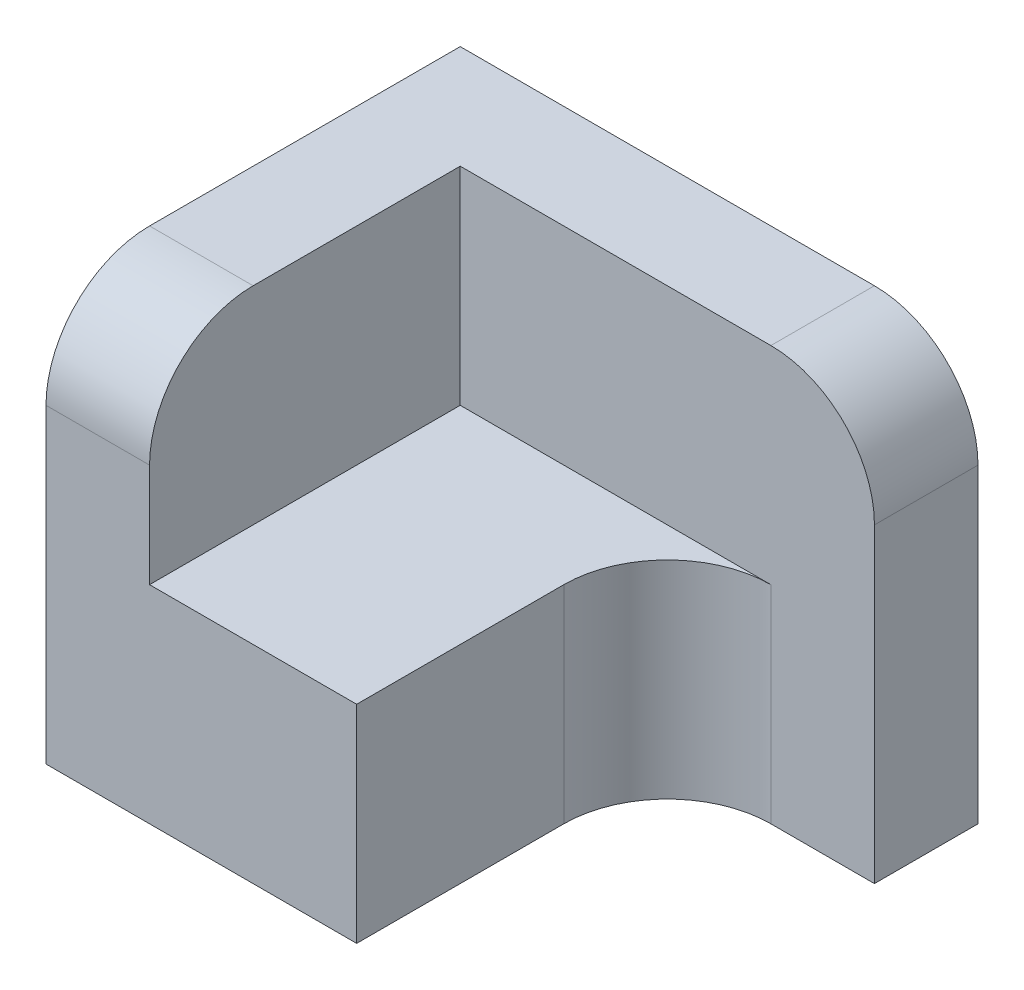
ISO-10303-21;
HEADER;
FILE_DESCRIPTION(('STEP AP214'),'2;1');
FILE_NAME('part.step','',(''),(''),'','','');
FILE_SCHEMA(('AUTOMOTIVE_DESIGN { 1 0 10303 214 1 1 1 1 }'));
ENDSEC;
DATA;
#1=APPLICATION_CONTEXT('core data for automotive mechanical design processes');
#2=APPLICATION_PROTOCOL_DEFINITION('international standard','automotive_design',2000,#1);
#3=PRODUCT_CONTEXT('',#1,'mechanical');
#4=PRODUCT('Part','Part','',(#3));
#5=PRODUCT_RELATED_PRODUCT_CATEGORY('part','',(#4));
#6=PRODUCT_DEFINITION_FORMATION('','',#4);
#7=PRODUCT_DEFINITION_CONTEXT('part definition',#1,'design');
#8=PRODUCT_DEFINITION('design','',#6,#7);
#9=PRODUCT_DEFINITION_SHAPE('','',#8);
#10=(LENGTH_UNIT() NAMED_UNIT(*) SI_UNIT(.MILLI.,.METRE.));
#11=(NAMED_UNIT(*) PLANE_ANGLE_UNIT() SI_UNIT($,.RADIAN.));
#12=(NAMED_UNIT(*) SI_UNIT($,.STERADIAN.) SOLID_ANGLE_UNIT());
#13=UNCERTAINTY_MEASURE_WITH_UNIT(LENGTH_MEASURE(1.E-05),#10,'distance_accuracy_value','');
#14=(GEOMETRIC_REPRESENTATION_CONTEXT(3) GLOBAL_UNCERTAINTY_ASSIGNED_CONTEXT((#13)) GLOBAL_UNIT_ASSIGNED_CONTEXT((#10,
#11,#12)) REPRESENTATION_CONTEXT('',''));
#15=CARTESIAN_POINT('',(0.,0.,0.));
#16=DIRECTION('',(0.,0.,1.));
#17=DIRECTION('',(1.,0.,0.));
#18=AXIS2_PLACEMENT_3D('',#15,#16,#17);
#19=CARTESIAN_POINT('',(25.,10.,0.));
#20=DIRECTION('',(-1.,0.,0.));
#21=DIRECTION('',(0.,0.,1.));
#22=AXIS2_PLACEMENT_3D('',#19,#20,#21);
#23=PLANE('',#22);
#24=DIRECTION('',(0.,-1.,0.));
#25=VECTOR('',#24,1.);
#26=CARTESIAN_POINT('',(25.,10.,0.));
#27=LINE('',#26,#25);
#28=CARTESIAN_POINT('',(25.,15.,0.));
#29=VERTEX_POINT('',#28);
#30=CARTESIAN_POINT('',(25.,0.,0.));
#31=VERTEX_POINT('',#30);
#32=EDGE_CURVE('E144',#29,#31,#27,.T.);
#33=ORIENTED_EDGE('',*,*,#32,.F.);
#34=DIRECTION('',(0.,0.,-1.));
#35=VECTOR('',#34,1.);
#36=CARTESIAN_POINT('',(25.,15.,5.));
#37=LINE('',#36,#35);
#38=CARTESIAN_POINT('',(25.,15.,5.));
#39=VERTEX_POINT('',#38);
#40=EDGE_CURVE('E178',#29,#39,#37,.F.);
#41=ORIENTED_EDGE('',*,*,#40,.T.);
#42=DIRECTION('',(0.,-1.,0.));
#43=VECTOR('',#42,1.);
#44=CARTESIAN_POINT('',(25.,20.,5.));
#45=LINE('',#44,#43);
#46=CARTESIAN_POINT('',(25.,0.,5.));
#47=VERTEX_POINT('',#46);
#48=EDGE_CURVE('E150',#39,#47,#45,.T.);
#49=ORIENTED_EDGE('',*,*,#48,.T.);
#50=DIRECTION('',(0.,0.,-1.));
#51=VECTOR('',#50,1.);
#52=CARTESIAN_POINT('',(25.,0.,0.));
#53=LINE('',#52,#51);
#54=EDGE_CURVE('E146',#47,#31,#53,.T.);
#55=ORIENTED_EDGE('',*,*,#54,.T.);
#56=EDGE_LOOP('',(#33,#41,#49,#55));
#57=FACE_BOUND('',#56,.T.);
#58=ADVANCED_FACE('F33',(#57),#23,.F.);
#59=CARTESIAN_POINT('',(0.,10.,0.));
#60=DIRECTION('',(0.,1.,0.));
#61=DIRECTION('',(0.,0.,1.));
#62=AXIS2_PLACEMENT_3D('',#59,#60,#61);
#63=PLANE('',#62);
#64=DIRECTION('',(0.,0.,1.));
#65=VECTOR('',#64,1.);
#66=CARTESIAN_POINT('',(15.,10.,-9.14213562373095));
#67=LINE('',#66,#65);
#68=CARTESIAN_POINT('',(15.,10.,9.99999999999999));
#69=VERTEX_POINT('',#68);
#70=CARTESIAN_POINT('',(15.,10.,20.));
#71=VERTEX_POINT('',#70);
#72=EDGE_CURVE('E117',#69,#71,#67,.T.);
#73=ORIENTED_EDGE('',*,*,#72,.F.);
#74=CARTESIAN_POINT('',(20.,10.,10.));
#75=DIRECTION('',(0.,1.,0.));
#76=DIRECTION('',(0.,0.,1.));
#77=AXIS2_PLACEMENT_3D('',#74,#75,#76);
#78=CIRCLE('',#77,5.);
#79=CARTESIAN_POINT('',(20.,10.,5.));
#80=VERTEX_POINT('',#79);
#81=EDGE_CURVE('E41',#69,#80,#78,.F.);
#82=ORIENTED_EDGE('',*,*,#81,.T.);
#83=DIRECTION('',(-1.,0.,0.));
#84=VECTOR('',#83,1.);
#85=CARTESIAN_POINT('',(0.,10.,5.));
#86=LINE('',#85,#84);
#87=CARTESIAN_POINT('',(5.,10.,5.));
#88=VERTEX_POINT('',#87);
#89=EDGE_CURVE('E180',#80,#88,#86,.T.);
#90=ORIENTED_EDGE('',*,*,#89,.T.);
#91=DIRECTION('',(0.,0.,-1.));
#92=VECTOR('',#91,1.);
#93=CARTESIAN_POINT('',(5.00000000000001,10.,0.));
#94=LINE('',#93,#92);
#95=CARTESIAN_POINT('',(5.,10.,20.));
#96=VERTEX_POINT('',#95);
#97=EDGE_CURVE('E139',#96,#88,#94,.T.);
#98=ORIENTED_EDGE('',*,*,#97,.F.);
#99=DIRECTION('',(1.,0.,0.));
#100=VECTOR('',#99,1.);
#101=CARTESIAN_POINT('',(0.,10.,20.));
#102=LINE('',#101,#100);
#103=EDGE_CURVE('E132',#96,#71,#102,.T.);
#104=ORIENTED_EDGE('',*,*,#103,.T.);
#105=EDGE_LOOP('',(#73,#82,#90,#98,#104));
#106=FACE_BOUND('',#105,.T.);
#107=ADVANCED_FACE('F137',(#106),#63,.T.);
#108=CARTESIAN_POINT('',(0.,10.,0.));
#109=DIRECTION('',(1.,0.,0.));
#110=DIRECTION('',(0.,0.,-1.));
#111=AXIS2_PLACEMENT_3D('',#108,#109,#110);
#112=PLANE('',#111);
#113=DIRECTION('',(0.,-1.,0.));
#114=VECTOR('',#113,1.);
#115=CARTESIAN_POINT('',(0.,10.,20.));
#116=LINE('',#115,#114);
#117=CARTESIAN_POINT('',(0.,15.,20.));
#118=VERTEX_POINT('',#117);
#119=CARTESIAN_POINT('',(0.,0.,20.));
#120=VERTEX_POINT('',#119);
#121=EDGE_CURVE('E159',#118,#120,#116,.T.);
#122=ORIENTED_EDGE('',*,*,#121,.F.);
#123=CARTESIAN_POINT('',(0.,15.,15.));
#124=DIRECTION('',(1.,0.,0.));
#125=DIRECTION('',(0.,0.,-1.));
#126=AXIS2_PLACEMENT_3D('',#123,#124,#125);
#127=CIRCLE('',#126,5.);
#128=CARTESIAN_POINT('',(0.,20.,15.));
#129=VERTEX_POINT('',#128);
#130=EDGE_CURVE('E175',#118,#129,#127,.F.);
#131=ORIENTED_EDGE('',*,*,#130,.T.);
#132=DIRECTION('',(0.,0.,1.));
#133=VECTOR('',#132,1.);
#134=CARTESIAN_POINT('',(0.,20.,0.));
#135=LINE('',#134,#133);
#136=CARTESIAN_POINT('',(0.,20.,0.));
#137=VERTEX_POINT('',#136);
#138=EDGE_CURVE('E204',#137,#129,#135,.T.);
#139=ORIENTED_EDGE('',*,*,#138,.F.);
#140=DIRECTION('',(0.,-1.,0.));
#141=VECTOR('',#140,1.);
#142=CARTESIAN_POINT('',(0.,10.,0.));
#143=LINE('',#142,#141);
#144=CARTESIAN_POINT('',(0.,0.,0.));
#145=VERTEX_POINT('',#144);
#146=EDGE_CURVE('E140',#137,#145,#143,.T.);
#147=ORIENTED_EDGE('',*,*,#146,.T.);
#148=DIRECTION('',(0.,0.,1.));
#149=VECTOR('',#148,1.);
#150=CARTESIAN_POINT('',(0.,0.,0.));
#151=LINE('',#150,#149);
#152=EDGE_CURVE('E152',#145,#120,#151,.T.);
#153=ORIENTED_EDGE('',*,*,#152,.T.);
#154=EDGE_LOOP('',(#122,#131,#139,#147,#153));
#155=FACE_BOUND('',#154,.T.);
#156=ADVANCED_FACE('F226',(#155),#112,.F.);
#157=CARTESIAN_POINT('',(0.,10.,20.));
#158=DIRECTION('',(0.,0.,-1.));
#159=DIRECTION('',(-1.,0.,0.));
#160=AXIS2_PLACEMENT_3D('',#157,#158,#159);
#161=PLANE('',#160);
#162=DIRECTION('',(0.,-1.,0.));
#163=VECTOR('',#162,1.);
#164=CARTESIAN_POINT('',(5.,20.,20.));
#165=LINE('',#164,#163);
#166=CARTESIAN_POINT('',(5.,15.,20.));
#167=VERTEX_POINT('',#166);
#168=EDGE_CURVE('E211',#167,#96,#165,.T.);
#169=ORIENTED_EDGE('',*,*,#168,.F.);
#170=DIRECTION('',(1.,0.,0.));
#171=VECTOR('',#170,1.);
#172=CARTESIAN_POINT('',(0.,15.,20.));
#173=LINE('',#172,#171);
#174=EDGE_CURVE('E56',#167,#118,#173,.F.);
#175=ORIENTED_EDGE('',*,*,#174,.T.);
#176=ORIENTED_EDGE('',*,*,#121,.T.);
#177=DIRECTION('',(1.,0.,0.));
#178=VECTOR('',#177,1.);
#179=CARTESIAN_POINT('',(0.,0.,20.));
#180=LINE('',#179,#178);
#181=CARTESIAN_POINT('',(15.,0.,20.));
#182=VERTEX_POINT('',#181);
#183=EDGE_CURVE('E134',#120,#182,#180,.T.);
#184=ORIENTED_EDGE('',*,*,#183,.T.);
#185=DIRECTION('',(0.,-1.,0.));
#186=VECTOR('',#185,1.);
#187=CARTESIAN_POINT('',(15.,10.,20.));
#188=LINE('',#187,#186);
#189=EDGE_CURVE('E121',#71,#182,#188,.T.);
#190=ORIENTED_EDGE('',*,*,#189,.F.);
#191=ORIENTED_EDGE('',*,*,#103,.F.);
#192=EDGE_LOOP('',(#169,#175,#176,#184,#190,#191));
#193=FACE_BOUND('',#192,.T.);
#194=ADVANCED_FACE('F131',(#193),#161,.F.);
#195=CARTESIAN_POINT('',(0.,10.,0.));
#196=DIRECTION('',(0.,0.,1.));
#197=DIRECTION('',(1.,0.,0.));
#198=AXIS2_PLACEMENT_3D('',#195,#196,#197);
#199=PLANE('',#198);
#200=DIRECTION('',(-1.,0.,0.));
#201=VECTOR('',#200,1.);
#202=CARTESIAN_POINT('',(0.,20.,0.));
#203=LINE('',#202,#201);
#204=CARTESIAN_POINT('',(20.,20.,0.));
#205=VERTEX_POINT('',#204);
#206=EDGE_CURVE('E202',#205,#137,#203,.T.);
#207=ORIENTED_EDGE('',*,*,#206,.F.);
#208=CARTESIAN_POINT('',(20.,15.,0.));
#209=DIRECTION('',(0.,0.,1.));
#210=DIRECTION('',(1.,0.,0.));
#211=AXIS2_PLACEMENT_3D('',#208,#209,#210);
#212=CIRCLE('',#211,5.);
#213=EDGE_CURVE('E48',#205,#29,#212,.F.);
#214=ORIENTED_EDGE('',*,*,#213,.T.);
#215=ORIENTED_EDGE('',*,*,#32,.T.);
#216=DIRECTION('',(-1.,0.,0.));
#217=VECTOR('',#216,1.);
#218=CARTESIAN_POINT('',(0.,0.,0.));
#219=LINE('',#218,#217);
#220=EDGE_CURVE('E141',#31,#145,#219,.T.);
#221=ORIENTED_EDGE('',*,*,#220,.T.);
#222=ORIENTED_EDGE('',*,*,#146,.F.);
#223=EDGE_LOOP('',(#207,#214,#215,#221,#222));
#224=FACE_BOUND('',#223,.T.);
#225=ADVANCED_FACE('F222',(#224),#199,.F.);
#226=CARTESIAN_POINT('',(0.,0.,0.));
#227=DIRECTION('',(0.,1.,0.));
#228=DIRECTION('',(0.,0.,1.));
#229=AXIS2_PLACEMENT_3D('',#226,#227,#228);
#230=PLANE('',#229);
#231=DIRECTION('',(-1.,0.,0.));
#232=VECTOR('',#231,1.);
#233=CARTESIAN_POINT('',(25.,0.,5.));
#234=LINE('',#233,#232);
#235=CARTESIAN_POINT('',(20.,0.,5.));
#236=VERTEX_POINT('',#235);
#237=EDGE_CURVE('E190',#47,#236,#234,.T.);
#238=ORIENTED_EDGE('',*,*,#237,.T.);
#239=CARTESIAN_POINT('',(20.,0.,10.));
#240=DIRECTION('',(0.,1.,0.));
#241=DIRECTION('',(0.,0.,1.));
#242=AXIS2_PLACEMENT_3D('',#239,#240,#241);
#243=CIRCLE('',#242,5.);
#244=CARTESIAN_POINT('',(15.,0.,9.99999999999999));
#245=VERTEX_POINT('',#244);
#246=EDGE_CURVE('E11',#236,#245,#243,.T.);
#247=ORIENTED_EDGE('',*,*,#246,.T.);
#248=DIRECTION('',(0.,0.,1.));
#249=VECTOR('',#248,1.);
#250=CARTESIAN_POINT('',(15.,0.,-9.14213562373095));
#251=LINE('',#250,#249);
#252=EDGE_CURVE('E128',#245,#182,#251,.T.);
#253=ORIENTED_EDGE('',*,*,#252,.T.);
#254=ORIENTED_EDGE('',*,*,#183,.F.);
#255=ORIENTED_EDGE('',*,*,#152,.F.);
#256=ORIENTED_EDGE('',*,*,#220,.F.);
#257=ORIENTED_EDGE('',*,*,#54,.F.);
#258=EDGE_LOOP('',(#238,#247,#253,#254,#255,#256,#257));
#259=FACE_BOUND('',#258,.T.);
#260=ADVANCED_FACE('F193',(#259),#230,.F.);
#261=CARTESIAN_POINT('',(0.,20.,5.));
#262=DIRECTION('',(0.,0.,1.));
#263=DIRECTION('',(1.,0.,0.));
#264=AXIS2_PLACEMENT_3D('',#261,#262,#263);
#265=PLANE('',#264);
#266=ORIENTED_EDGE('',*,*,#89,.F.);
#267=DIRECTION('',(0.,1.,0.));
#268=VECTOR('',#267,1.);
#269=CARTESIAN_POINT('',(20.,20.,5.));
#270=LINE('',#269,#268);
#271=EDGE_CURVE('E164',#80,#236,#270,.F.);
#272=ORIENTED_EDGE('',*,*,#271,.T.);
#273=ORIENTED_EDGE('',*,*,#237,.F.);
#274=ORIENTED_EDGE('',*,*,#48,.F.);
#275=CARTESIAN_POINT('',(20.,15.,5.));
#276=DIRECTION('',(0.,0.,1.));
#277=DIRECTION('',(1.,0.,0.));
#278=AXIS2_PLACEMENT_3D('',#275,#276,#277);
#279=CIRCLE('',#278,5.);
#280=CARTESIAN_POINT('',(20.,20.,5.));
#281=VERTEX_POINT('',#280);
#282=EDGE_CURVE('E162',#39,#281,#279,.T.);
#283=ORIENTED_EDGE('',*,*,#282,.T.);
#284=DIRECTION('',(-1.,0.,0.));
#285=VECTOR('',#284,1.);
#286=CARTESIAN_POINT('',(0.,20.,5.));
#287=LINE('',#286,#285);
#288=CARTESIAN_POINT('',(5.,20.,5.));
#289=VERTEX_POINT('',#288);
#290=EDGE_CURVE('E199',#281,#289,#287,.T.);
#291=ORIENTED_EDGE('',*,*,#290,.T.);
#292=DIRECTION('',(0.,-1.,0.));
#293=VECTOR('',#292,1.);
#294=CARTESIAN_POINT('',(5.,20.,5.));
#295=LINE('',#294,#293);
#296=EDGE_CURVE('E208',#289,#88,#295,.T.);
#297=ORIENTED_EDGE('',*,*,#296,.T.);
#298=EDGE_LOOP('',(#266,#272,#273,#274,#283,#291,#297));
#299=FACE_BOUND('',#298,.T.);
#300=ADVANCED_FACE('F188',(#299),#265,.T.);
#301=CARTESIAN_POINT('',(5.00000000000001,20.,0.));
#302=DIRECTION('',(-1.,0.,0.));
#303=DIRECTION('',(0.,0.,1.));
#304=AXIS2_PLACEMENT_3D('',#301,#302,#303);
#305=PLANE('',#304);
#306=DIRECTION('',(0.,0.,-1.));
#307=VECTOR('',#306,1.);
#308=CARTESIAN_POINT('',(5.00000000000001,20.,0.));
#309=LINE('',#308,#307);
#310=CARTESIAN_POINT('',(5.,20.,15.));
#311=VERTEX_POINT('',#310);
#312=EDGE_CURVE('E207',#311,#289,#309,.T.);
#313=ORIENTED_EDGE('',*,*,#312,.F.);
#314=CARTESIAN_POINT('',(5.,15.,15.));
#315=DIRECTION('',(-1.,0.,0.));
#316=DIRECTION('',(0.,0.,1.));
#317=AXIS2_PLACEMENT_3D('',#314,#315,#316);
#318=CIRCLE('',#317,5.);
#319=EDGE_CURVE('E172',#311,#167,#318,.F.);
#320=ORIENTED_EDGE('',*,*,#319,.T.);
#321=ORIENTED_EDGE('',*,*,#168,.T.);
#322=ORIENTED_EDGE('',*,*,#97,.T.);
#323=ORIENTED_EDGE('',*,*,#296,.F.);
#324=EDGE_LOOP('',(#313,#320,#321,#322,#323));
#325=FACE_BOUND('',#324,.T.);
#326=ADVANCED_FACE('F232',(#325),#305,.F.);
#327=CARTESIAN_POINT('',(0.,20.,0.));
#328=DIRECTION('',(0.,1.,0.));
#329=DIRECTION('',(0.,0.,1.));
#330=AXIS2_PLACEMENT_3D('',#327,#328,#329);
#331=PLANE('',#330);
#332=ORIENTED_EDGE('',*,*,#138,.T.);
#333=DIRECTION('',(1.,0.,0.));
#334=VECTOR('',#333,1.);
#335=CARTESIAN_POINT('',(5.,20.,15.));
#336=LINE('',#335,#334);
#337=EDGE_CURVE('E169',#129,#311,#336,.T.);
#338=ORIENTED_EDGE('',*,*,#337,.T.);
#339=ORIENTED_EDGE('',*,*,#312,.T.);
#340=ORIENTED_EDGE('',*,*,#290,.F.);
#341=DIRECTION('',(0.,0.,-1.));
#342=VECTOR('',#341,1.);
#343=CARTESIAN_POINT('',(20.,20.,0.));
#344=LINE('',#343,#342);
#345=EDGE_CURVE('E166',#281,#205,#344,.T.);
#346=ORIENTED_EDGE('',*,*,#345,.T.);
#347=ORIENTED_EDGE('',*,*,#206,.T.);
#348=EDGE_LOOP('',(#332,#338,#339,#340,#346,#347));
#349=FACE_BOUND('',#348,.T.);
#350=ADVANCED_FACE('F220',(#349),#331,.T.);
#351=CARTESIAN_POINT('',(15.,10.,-9.14213562373095));
#352=DIRECTION('',(-1.,0.,0.));
#353=DIRECTION('',(0.,-1.,0.));
#354=AXIS2_PLACEMENT_3D('',#351,#352,#353);
#355=PLANE('',#354);
#356=ORIENTED_EDGE('',*,*,#252,.F.);
#357=DIRECTION('',(0.,1.,0.));
#358=VECTOR('',#357,1.);
#359=CARTESIAN_POINT('',(15.,10.,10.));
#360=LINE('',#359,#358);
#361=EDGE_CURVE('E124',#245,#69,#360,.T.);
#362=ORIENTED_EDGE('',*,*,#361,.T.);
#363=ORIENTED_EDGE('',*,*,#72,.T.);
#364=ORIENTED_EDGE('',*,*,#189,.T.);
#365=EDGE_LOOP('',(#356,#362,#363,#364));
#366=FACE_BOUND('',#365,.T.);
#367=ADVANCED_FACE('F120',(#366),#355,.F.);
#368=CARTESIAN_POINT('',(20.,10.,10.));
#369=DIRECTION('',(0.,1.,0.));
#370=DIRECTION('',(-1.,0.,0.));
#371=AXIS2_PLACEMENT_3D('',#368,#369,#370);
#372=CYLINDRICAL_SURFACE('',#371,5.);
#373=ORIENTED_EDGE('',*,*,#246,.F.);
#374=ORIENTED_EDGE('',*,*,#271,.F.);
#375=ORIENTED_EDGE('',*,*,#81,.F.);
#376=ORIENTED_EDGE('',*,*,#361,.F.);
#377=EDGE_LOOP('',(#373,#374,#375,#376));
#378=FACE_BOUND('',#377,.T.);
#379=ADVANCED_FACE('F184',(#378),#372,.F.);
#380=CARTESIAN_POINT('',(0.,15.,15.));
#381=DIRECTION('',(-1.,0.,0.));
#382=DIRECTION('',(0.,0.,1.));
#383=AXIS2_PLACEMENT_3D('',#380,#381,#382);
#384=CYLINDRICAL_SURFACE('',#383,5.);
#385=ORIENTED_EDGE('',*,*,#130,.F.);
#386=ORIENTED_EDGE('',*,*,#174,.F.);
#387=ORIENTED_EDGE('',*,*,#319,.F.);
#388=ORIENTED_EDGE('',*,*,#337,.F.);
#389=EDGE_LOOP('',(#385,#386,#387,#388));
#390=FACE_BOUND('',#389,.T.);
#391=ADVANCED_FACE('F231',(#390),#384,.T.);
#392=CARTESIAN_POINT('',(20.,15.,0.));
#393=DIRECTION('',(0.,0.,1.));
#394=DIRECTION('',(1.,0.,0.));
#395=AXIS2_PLACEMENT_3D('',#392,#393,#394);
#396=CYLINDRICAL_SURFACE('',#395,5.);
#397=ORIENTED_EDGE('',*,*,#282,.F.);
#398=ORIENTED_EDGE('',*,*,#40,.F.);
#399=ORIENTED_EDGE('',*,*,#213,.F.);
#400=ORIENTED_EDGE('',*,*,#345,.F.);
#401=EDGE_LOOP('',(#397,#398,#399,#400));
#402=FACE_BOUND('',#401,.T.);
#403=ADVANCED_FACE('F35',(#402),#396,.T.);
#404=CLOSED_SHELL('',(#58,#107,#156,#194,#225,#260,#300,#326,#350,#367,#379,#391,#403));
#405=MANIFOLD_SOLID_BREP('B2',#404);
#406=ADVANCED_BREP_SHAPE_REPRESENTATION('',(#18,#405),#14);
#407=SHAPE_DEFINITION_REPRESENTATION(#9,#406);
ENDSEC;
END-ISO-10303-21;
